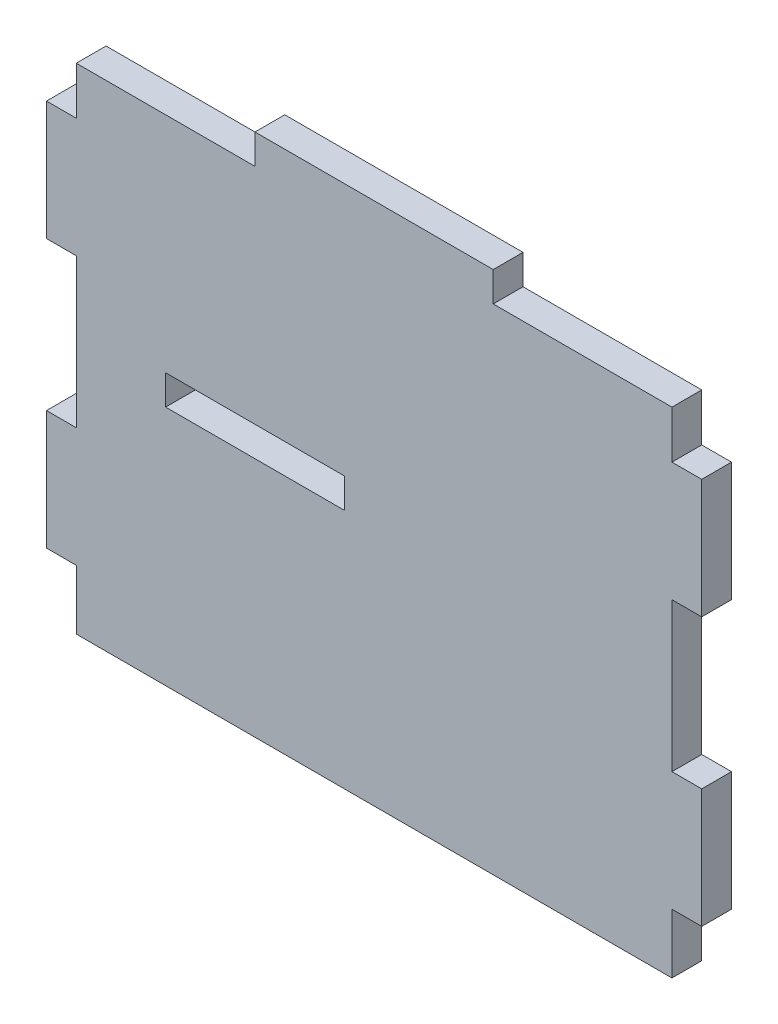
ISO-10303-21;
HEADER;
FILE_DESCRIPTION(('STEP AP214'),'2;1');
FILE_NAME('part.step','',(''),(''),'','','');
FILE_SCHEMA(('AUTOMOTIVE_DESIGN { 1 0 10303 214 1 1 1 1 }'));
ENDSEC;
DATA;
#1=APPLICATION_CONTEXT('core data for automotive mechanical design processes');
#2=APPLICATION_PROTOCOL_DEFINITION('international standard','automotive_design',2000,#1);
#3=PRODUCT_CONTEXT('',#1,'mechanical');
#4=PRODUCT('Part','Part','',(#3));
#5=PRODUCT_RELATED_PRODUCT_CATEGORY('part','',(#4));
#6=PRODUCT_DEFINITION_FORMATION('','',#4);
#7=PRODUCT_DEFINITION_CONTEXT('part definition',#1,'design');
#8=PRODUCT_DEFINITION('design','',#6,#7);
#9=PRODUCT_DEFINITION_SHAPE('','',#8);
#10=(LENGTH_UNIT() NAMED_UNIT(*) SI_UNIT(.MILLI.,.METRE.));
#11=(NAMED_UNIT(*) PLANE_ANGLE_UNIT() SI_UNIT($,.RADIAN.));
#12=(NAMED_UNIT(*) SI_UNIT($,.STERADIAN.) SOLID_ANGLE_UNIT());
#13=UNCERTAINTY_MEASURE_WITH_UNIT(LENGTH_MEASURE(1.E-05),#10,'distance_accuracy_value','');
#14=(GEOMETRIC_REPRESENTATION_CONTEXT(3) GLOBAL_UNCERTAINTY_ASSIGNED_CONTEXT((#13)) GLOBAL_UNIT_ASSIGNED_CONTEXT((#10,
#11,#12)) REPRESENTATION_CONTEXT('',''));
#15=CARTESIAN_POINT('',(0.,0.,0.));
#16=DIRECTION('',(0.,0.,1.));
#17=DIRECTION('',(1.,0.,0.));
#18=AXIS2_PLACEMENT_3D('',#15,#16,#17);
#19=CARTESIAN_POINT('',(0.,0.,5.));
#20=DIRECTION('',(0.,0.,1.));
#21=DIRECTION('',(1.,0.,0.));
#22=AXIS2_PLACEMENT_3D('',#19,#20,#21);
#23=PLANE('',#22);
#24=DIRECTION('',(0.,-1.,0.));
#25=VECTOR('',#24,1.);
#26=CARTESIAN_POINT('',(0.,0.,5.));
#27=LINE('',#26,#25);
#28=CARTESIAN_POINT('',(0.,10.,5.));
#29=VERTEX_POINT('',#28);
#30=CARTESIAN_POINT('',(0.,0.,5.));
#31=VERTEX_POINT('',#30);
#32=EDGE_CURVE('E275',#29,#31,#27,.T.);
#33=ORIENTED_EDGE('',*,*,#32,.T.);
#34=DIRECTION('',(1.,0.,0.));
#35=VECTOR('',#34,1.);
#36=CARTESIAN_POINT('',(0.,0.,5.));
#37=LINE('',#36,#35);
#38=CARTESIAN_POINT('',(100.,0.,5.));
#39=VERTEX_POINT('',#38);
#40=EDGE_CURVE('E279',#31,#39,#37,.T.);
#41=ORIENTED_EDGE('',*,*,#40,.T.);
#42=DIRECTION('',(0.,1.,0.));
#43=VECTOR('',#42,1.);
#44=CARTESIAN_POINT('',(100.,0.,5.));
#45=LINE('',#44,#43);
#46=CARTESIAN_POINT('',(100.,10.,5.));
#47=VERTEX_POINT('',#46);
#48=EDGE_CURVE('E283',#39,#47,#45,.T.);
#49=ORIENTED_EDGE('',*,*,#48,.T.);
#50=DIRECTION('',(1.,0.,0.));
#51=VECTOR('',#50,1.);
#52=CARTESIAN_POINT('',(100.,10.,5.));
#53=LINE('',#52,#51);
#54=CARTESIAN_POINT('',(105.,10.,5.));
#55=VERTEX_POINT('',#54);
#56=EDGE_CURVE('E286',#47,#55,#53,.T.);
#57=ORIENTED_EDGE('',*,*,#56,.T.);
#58=DIRECTION('',(0.,1.,0.));
#59=VECTOR('',#58,1.);
#60=CARTESIAN_POINT('',(105.,30.,5.));
#61=LINE('',#60,#59);
#62=CARTESIAN_POINT('',(105.,30.,5.));
#63=VERTEX_POINT('',#62);
#64=EDGE_CURVE('E289',#55,#63,#61,.T.);
#65=ORIENTED_EDGE('',*,*,#64,.T.);
#66=DIRECTION('',(-1.,0.,0.));
#67=VECTOR('',#66,1.);
#68=CARTESIAN_POINT('',(100.,30.,5.));
#69=LINE('',#68,#67);
#70=CARTESIAN_POINT('',(100.,30.,5.));
#71=VERTEX_POINT('',#70);
#72=EDGE_CURVE('E292',#63,#71,#69,.T.);
#73=ORIENTED_EDGE('',*,*,#72,.T.);
#74=DIRECTION('',(0.,1.,0.));
#75=VECTOR('',#74,1.);
#76=CARTESIAN_POINT('',(100.,30.,5.));
#77=LINE('',#76,#75);
#78=CARTESIAN_POINT('',(100.,55.,5.));
#79=VERTEX_POINT('',#78);
#80=EDGE_CURVE('E295',#71,#79,#77,.T.);
#81=ORIENTED_EDGE('',*,*,#80,.T.);
#82=DIRECTION('',(1.,0.,0.));
#83=VECTOR('',#82,1.);
#84=CARTESIAN_POINT('',(100.,55.,5.));
#85=LINE('',#84,#83);
#86=CARTESIAN_POINT('',(105.,55.,5.));
#87=VERTEX_POINT('',#86);
#88=EDGE_CURVE('E298',#79,#87,#85,.T.);
#89=ORIENTED_EDGE('',*,*,#88,.T.);
#90=DIRECTION('',(0.,1.,0.));
#91=VECTOR('',#90,1.);
#92=CARTESIAN_POINT('',(105.,75.,5.));
#93=LINE('',#92,#91);
#94=CARTESIAN_POINT('',(105.,75.,5.));
#95=VERTEX_POINT('',#94);
#96=EDGE_CURVE('E301',#87,#95,#93,.T.);
#97=ORIENTED_EDGE('',*,*,#96,.T.);
#98=DIRECTION('',(-1.,0.,0.));
#99=VECTOR('',#98,1.);
#100=CARTESIAN_POINT('',(100.,75.,5.));
#101=LINE('',#100,#99);
#102=CARTESIAN_POINT('',(100.,75.,5.));
#103=VERTEX_POINT('',#102);
#104=EDGE_CURVE('E304',#95,#103,#101,.T.);
#105=ORIENTED_EDGE('',*,*,#104,.T.);
#106=DIRECTION('',(0.,1.,0.));
#107=VECTOR('',#106,1.);
#108=CARTESIAN_POINT('',(100.,75.,5.));
#109=LINE('',#108,#107);
#110=CARTESIAN_POINT('',(100.,83.,5.));
#111=VERTEX_POINT('',#110);
#112=EDGE_CURVE('E307',#103,#111,#109,.T.);
#113=ORIENTED_EDGE('',*,*,#112,.T.);
#114=DIRECTION('',(-1.,0.,0.));
#115=VECTOR('',#114,1.);
#116=CARTESIAN_POINT('',(70.,83.,5.));
#117=LINE('',#116,#115);
#118=CARTESIAN_POINT('',(70.,83.,5.));
#119=VERTEX_POINT('',#118);
#120=EDGE_CURVE('E310',#111,#119,#117,.T.);
#121=ORIENTED_EDGE('',*,*,#120,.T.);
#122=DIRECTION('',(0.,1.,0.));
#123=VECTOR('',#122,1.);
#124=CARTESIAN_POINT('',(70.,83.,5.));
#125=LINE('',#124,#123);
#126=CARTESIAN_POINT('',(70.,88.,5.));
#127=VERTEX_POINT('',#126);
#128=EDGE_CURVE('E313',#119,#127,#125,.T.);
#129=ORIENTED_EDGE('',*,*,#128,.T.);
#130=DIRECTION('',(-1.,0.,0.));
#131=VECTOR('',#130,1.);
#132=CARTESIAN_POINT('',(30.,88.,5.));
#133=LINE('',#132,#131);
#134=CARTESIAN_POINT('',(30.,88.,5.));
#135=VERTEX_POINT('',#134);
#136=EDGE_CURVE('E316',#127,#135,#133,.T.);
#137=ORIENTED_EDGE('',*,*,#136,.T.);
#138=DIRECTION('',(0.,-1.,0.));
#139=VECTOR('',#138,1.);
#140=CARTESIAN_POINT('',(30.,83.,5.));
#141=LINE('',#140,#139);
#142=CARTESIAN_POINT('',(30.,83.,5.));
#143=VERTEX_POINT('',#142);
#144=EDGE_CURVE('E319',#135,#143,#141,.T.);
#145=ORIENTED_EDGE('',*,*,#144,.T.);
#146=DIRECTION('',(-1.,0.,0.));
#147=VECTOR('',#146,1.);
#148=CARTESIAN_POINT('',(0.,83.,5.));
#149=LINE('',#148,#147);
#150=CARTESIAN_POINT('',(0.,83.,5.));
#151=VERTEX_POINT('',#150);
#152=EDGE_CURVE('E322',#143,#151,#149,.T.);
#153=ORIENTED_EDGE('',*,*,#152,.T.);
#154=DIRECTION('',(0.,-1.,0.));
#155=VECTOR('',#154,1.);
#156=CARTESIAN_POINT('',(0.,75.,5.));
#157=LINE('',#156,#155);
#158=CARTESIAN_POINT('',(0.,75.,5.));
#159=VERTEX_POINT('',#158);
#160=EDGE_CURVE('E325',#151,#159,#157,.T.);
#161=ORIENTED_EDGE('',*,*,#160,.T.);
#162=DIRECTION('',(-1.,0.,0.));
#163=VECTOR('',#162,1.);
#164=CARTESIAN_POINT('',(0.,75.,5.));
#165=LINE('',#164,#163);
#166=CARTESIAN_POINT('',(-5.,75.,5.));
#167=VERTEX_POINT('',#166);
#168=EDGE_CURVE('E328',#159,#167,#165,.T.);
#169=ORIENTED_EDGE('',*,*,#168,.T.);
#170=DIRECTION('',(0.,-1.,0.));
#171=VECTOR('',#170,1.);
#172=CARTESIAN_POINT('',(-5.,75.,5.));
#173=LINE('',#172,#171);
#174=CARTESIAN_POINT('',(-5.,55.,5.));
#175=VERTEX_POINT('',#174);
#176=EDGE_CURVE('E331',#167,#175,#173,.T.);
#177=ORIENTED_EDGE('',*,*,#176,.T.);
#178=DIRECTION('',(1.,0.,0.));
#179=VECTOR('',#178,1.);
#180=CARTESIAN_POINT('',(0.,55.,5.));
#181=LINE('',#180,#179);
#182=CARTESIAN_POINT('',(0.,55.,5.));
#183=VERTEX_POINT('',#182);
#184=EDGE_CURVE('E334',#175,#183,#181,.T.);
#185=ORIENTED_EDGE('',*,*,#184,.T.);
#186=DIRECTION('',(0.,-1.,0.));
#187=VECTOR('',#186,1.);
#188=CARTESIAN_POINT('',(0.,30.,5.));
#189=LINE('',#188,#187);
#190=CARTESIAN_POINT('',(0.,30.,5.));
#191=VERTEX_POINT('',#190);
#192=EDGE_CURVE('E337',#183,#191,#189,.T.);
#193=ORIENTED_EDGE('',*,*,#192,.T.);
#194=DIRECTION('',(-1.,0.,0.));
#195=VECTOR('',#194,1.);
#196=CARTESIAN_POINT('',(0.,30.,5.));
#197=LINE('',#196,#195);
#198=CARTESIAN_POINT('',(-5.,30.,5.));
#199=VERTEX_POINT('',#198);
#200=EDGE_CURVE('E340',#191,#199,#197,.T.);
#201=ORIENTED_EDGE('',*,*,#200,.T.);
#202=DIRECTION('',(0.,-1.,0.));
#203=VECTOR('',#202,1.);
#204=CARTESIAN_POINT('',(-5.,10.,5.));
#205=LINE('',#204,#203);
#206=CARTESIAN_POINT('',(-5.,10.,5.));
#207=VERTEX_POINT('',#206);
#208=EDGE_CURVE('E343',#199,#207,#205,.T.);
#209=ORIENTED_EDGE('',*,*,#208,.T.);
#210=DIRECTION('',(1.,0.,0.));
#211=VECTOR('',#210,1.);
#212=CARTESIAN_POINT('',(0.,10.,5.));
#213=LINE('',#212,#211);
#214=EDGE_CURVE('E346',#207,#29,#213,.T.);
#215=ORIENTED_EDGE('',*,*,#214,.T.);
#216=EDGE_LOOP('',(#33,#41,#49,#57,#65,#73,#81,#89,#97,#105,#113,#121,#129,#137,#145,#153,#161,
#169,#177,#185,#193,#201,#209,#215));
#217=FACE_BOUND('',#216,.T.);
#218=DIRECTION('',(1.,0.,0.));
#219=VECTOR('',#218,1.);
#220=CARTESIAN_POINT('',(15.,40.5,5.));
#221=LINE('',#220,#219);
#222=CARTESIAN_POINT('',(15.,40.5,5.));
#223=VERTEX_POINT('',#222);
#224=CARTESIAN_POINT('',(45.,40.5,5.));
#225=VERTEX_POINT('',#224);
#226=EDGE_CURVE('E236',#223,#225,#221,.T.);
#227=ORIENTED_EDGE('',*,*,#226,.F.);
#228=DIRECTION('',(0.,-1.,0.));
#229=VECTOR('',#228,1.);
#230=CARTESIAN_POINT('',(15.,45.5,5.));
#231=LINE('',#230,#229);
#232=CARTESIAN_POINT('',(15.,45.5,5.));
#233=VERTEX_POINT('',#232);
#234=EDGE_CURVE('E227',#233,#223,#231,.T.);
#235=ORIENTED_EDGE('',*,*,#234,.F.);
#236=DIRECTION('',(-1.,0.,0.));
#237=VECTOR('',#236,1.);
#238=CARTESIAN_POINT('',(15.,45.5,5.));
#239=LINE('',#238,#237);
#240=CARTESIAN_POINT('',(45.,45.5,5.));
#241=VERTEX_POINT('',#240);
#242=EDGE_CURVE('E253',#241,#233,#239,.T.);
#243=ORIENTED_EDGE('',*,*,#242,.F.);
#244=DIRECTION('',(0.,1.,0.));
#245=VECTOR('',#244,1.);
#246=CARTESIAN_POINT('',(45.,45.5,5.));
#247=LINE('',#246,#245);
#248=EDGE_CURVE('E249',#225,#241,#247,.T.);
#249=ORIENTED_EDGE('',*,*,#248,.F.);
#250=EDGE_LOOP('',(#227,#235,#243,#249));
#251=FACE_BOUND('',#250,.T.);
#252=ADVANCED_FACE('F41',(#217,#251),#23,.T.);
#253=CARTESIAN_POINT('',(0.,0.,0.));
#254=DIRECTION('',(0.,0.,1.));
#255=DIRECTION('',(1.,0.,0.));
#256=AXIS2_PLACEMENT_3D('',#253,#254,#255);
#257=PLANE('',#256);
#258=DIRECTION('',(0.,-1.,0.));
#259=VECTOR('',#258,1.);
#260=CARTESIAN_POINT('',(0.,0.,0.));
#261=LINE('',#260,#259);
#262=CARTESIAN_POINT('',(0.,10.,0.));
#263=VERTEX_POINT('',#262);
#264=CARTESIAN_POINT('',(0.,0.,0.));
#265=VERTEX_POINT('',#264);
#266=EDGE_CURVE('E245',#263,#265,#261,.T.);
#267=ORIENTED_EDGE('',*,*,#266,.F.);
#268=DIRECTION('',(1.,0.,0.));
#269=VECTOR('',#268,1.);
#270=CARTESIAN_POINT('',(0.,10.,0.));
#271=LINE('',#270,#269);
#272=CARTESIAN_POINT('',(-5.,10.,0.));
#273=VERTEX_POINT('',#272);
#274=EDGE_CURVE('E280',#273,#263,#271,.T.);
#275=ORIENTED_EDGE('',*,*,#274,.F.);
#276=DIRECTION('',(0.,-1.,0.));
#277=VECTOR('',#276,1.);
#278=CARTESIAN_POINT('',(-5.,10.,0.));
#279=LINE('',#278,#277);
#280=CARTESIAN_POINT('',(-5.,30.,0.));
#281=VERTEX_POINT('',#280);
#282=EDGE_CURVE('E416',#281,#273,#279,.T.);
#283=ORIENTED_EDGE('',*,*,#282,.F.);
#284=DIRECTION('',(-1.,0.,0.));
#285=VECTOR('',#284,1.);
#286=CARTESIAN_POINT('',(0.,30.,0.));
#287=LINE('',#286,#285);
#288=CARTESIAN_POINT('',(0.,30.,0.));
#289=VERTEX_POINT('',#288);
#290=EDGE_CURVE('E413',#289,#281,#287,.T.);
#291=ORIENTED_EDGE('',*,*,#290,.F.);
#292=DIRECTION('',(0.,-1.,0.));
#293=VECTOR('',#292,1.);
#294=CARTESIAN_POINT('',(0.,30.,0.));
#295=LINE('',#294,#293);
#296=CARTESIAN_POINT('',(0.,55.,0.));
#297=VERTEX_POINT('',#296);
#298=EDGE_CURVE('E410',#297,#289,#295,.T.);
#299=ORIENTED_EDGE('',*,*,#298,.F.);
#300=DIRECTION('',(1.,0.,0.));
#301=VECTOR('',#300,1.);
#302=CARTESIAN_POINT('',(0.,55.,0.));
#303=LINE('',#302,#301);
#304=CARTESIAN_POINT('',(-5.,55.,0.));
#305=VERTEX_POINT('',#304);
#306=EDGE_CURVE('E407',#305,#297,#303,.T.);
#307=ORIENTED_EDGE('',*,*,#306,.F.);
#308=DIRECTION('',(0.,-1.,0.));
#309=VECTOR('',#308,1.);
#310=CARTESIAN_POINT('',(-5.,75.,0.));
#311=LINE('',#310,#309);
#312=CARTESIAN_POINT('',(-5.,75.,0.));
#313=VERTEX_POINT('',#312);
#314=EDGE_CURVE('E404',#313,#305,#311,.T.);
#315=ORIENTED_EDGE('',*,*,#314,.F.);
#316=DIRECTION('',(-1.,0.,0.));
#317=VECTOR('',#316,1.);
#318=CARTESIAN_POINT('',(0.,75.,0.));
#319=LINE('',#318,#317);
#320=CARTESIAN_POINT('',(0.,75.,0.));
#321=VERTEX_POINT('',#320);
#322=EDGE_CURVE('E401',#321,#313,#319,.T.);
#323=ORIENTED_EDGE('',*,*,#322,.F.);
#324=DIRECTION('',(0.,-1.,0.));
#325=VECTOR('',#324,1.);
#326=CARTESIAN_POINT('',(0.,75.,0.));
#327=LINE('',#326,#325);
#328=CARTESIAN_POINT('',(0.,83.,0.));
#329=VERTEX_POINT('',#328);
#330=EDGE_CURVE('E398',#329,#321,#327,.T.);
#331=ORIENTED_EDGE('',*,*,#330,.F.);
#332=DIRECTION('',(-1.,0.,0.));
#333=VECTOR('',#332,1.);
#334=CARTESIAN_POINT('',(0.,83.,0.));
#335=LINE('',#334,#333);
#336=CARTESIAN_POINT('',(30.,83.,0.));
#337=VERTEX_POINT('',#336);
#338=EDGE_CURVE('E395',#337,#329,#335,.T.);
#339=ORIENTED_EDGE('',*,*,#338,.F.);
#340=DIRECTION('',(0.,-1.,0.));
#341=VECTOR('',#340,1.);
#342=CARTESIAN_POINT('',(30.,83.,0.));
#343=LINE('',#342,#341);
#344=CARTESIAN_POINT('',(30.,88.,0.));
#345=VERTEX_POINT('',#344);
#346=EDGE_CURVE('E392',#345,#337,#343,.T.);
#347=ORIENTED_EDGE('',*,*,#346,.F.);
#348=DIRECTION('',(-1.,0.,0.));
#349=VECTOR('',#348,1.);
#350=CARTESIAN_POINT('',(30.,88.,0.));
#351=LINE('',#350,#349);
#352=CARTESIAN_POINT('',(70.,88.,0.));
#353=VERTEX_POINT('',#352);
#354=EDGE_CURVE('E389',#353,#345,#351,.T.);
#355=ORIENTED_EDGE('',*,*,#354,.F.);
#356=DIRECTION('',(0.,1.,0.));
#357=VECTOR('',#356,1.);
#358=CARTESIAN_POINT('',(70.,83.,0.));
#359=LINE('',#358,#357);
#360=CARTESIAN_POINT('',(70.,83.,0.));
#361=VERTEX_POINT('',#360);
#362=EDGE_CURVE('E386',#361,#353,#359,.T.);
#363=ORIENTED_EDGE('',*,*,#362,.F.);
#364=DIRECTION('',(-1.,0.,0.));
#365=VECTOR('',#364,1.);
#366=CARTESIAN_POINT('',(70.,83.,0.));
#367=LINE('',#366,#365);
#368=CARTESIAN_POINT('',(100.,83.,0.));
#369=VERTEX_POINT('',#368);
#370=EDGE_CURVE('E383',#369,#361,#367,.T.);
#371=ORIENTED_EDGE('',*,*,#370,.F.);
#372=DIRECTION('',(0.,1.,0.));
#373=VECTOR('',#372,1.);
#374=CARTESIAN_POINT('',(100.,75.,0.));
#375=LINE('',#374,#373);
#376=CARTESIAN_POINT('',(100.,75.,0.));
#377=VERTEX_POINT('',#376);
#378=EDGE_CURVE('E380',#377,#369,#375,.T.);
#379=ORIENTED_EDGE('',*,*,#378,.F.);
#380=DIRECTION('',(-1.,0.,0.));
#381=VECTOR('',#380,1.);
#382=CARTESIAN_POINT('',(100.,75.,0.));
#383=LINE('',#382,#381);
#384=CARTESIAN_POINT('',(105.,75.,0.));
#385=VERTEX_POINT('',#384);
#386=EDGE_CURVE('E377',#385,#377,#383,.T.);
#387=ORIENTED_EDGE('',*,*,#386,.F.);
#388=DIRECTION('',(0.,1.,0.));
#389=VECTOR('',#388,1.);
#390=CARTESIAN_POINT('',(105.,75.,0.));
#391=LINE('',#390,#389);
#392=CARTESIAN_POINT('',(105.,55.,0.));
#393=VERTEX_POINT('',#392);
#394=EDGE_CURVE('E374',#393,#385,#391,.T.);
#395=ORIENTED_EDGE('',*,*,#394,.F.);
#396=DIRECTION('',(1.,0.,0.));
#397=VECTOR('',#396,1.);
#398=CARTESIAN_POINT('',(100.,55.,0.));
#399=LINE('',#398,#397);
#400=CARTESIAN_POINT('',(100.,55.,0.));
#401=VERTEX_POINT('',#400);
#402=EDGE_CURVE('E371',#401,#393,#399,.T.);
#403=ORIENTED_EDGE('',*,*,#402,.F.);
#404=DIRECTION('',(0.,1.,0.));
#405=VECTOR('',#404,1.);
#406=CARTESIAN_POINT('',(100.,30.,0.));
#407=LINE('',#406,#405);
#408=CARTESIAN_POINT('',(100.,30.,0.));
#409=VERTEX_POINT('',#408);
#410=EDGE_CURVE('E368',#409,#401,#407,.T.);
#411=ORIENTED_EDGE('',*,*,#410,.F.);
#412=DIRECTION('',(-1.,0.,0.));
#413=VECTOR('',#412,1.);
#414=CARTESIAN_POINT('',(100.,30.,0.));
#415=LINE('',#414,#413);
#416=CARTESIAN_POINT('',(105.,30.,0.));
#417=VERTEX_POINT('',#416);
#418=EDGE_CURVE('E365',#417,#409,#415,.T.);
#419=ORIENTED_EDGE('',*,*,#418,.F.);
#420=DIRECTION('',(0.,1.,0.));
#421=VECTOR('',#420,1.);
#422=CARTESIAN_POINT('',(105.,30.,0.));
#423=LINE('',#422,#421);
#424=CARTESIAN_POINT('',(105.,10.,0.));
#425=VERTEX_POINT('',#424);
#426=EDGE_CURVE('E362',#425,#417,#423,.T.);
#427=ORIENTED_EDGE('',*,*,#426,.F.);
#428=DIRECTION('',(1.,0.,0.));
#429=VECTOR('',#428,1.);
#430=CARTESIAN_POINT('',(100.,10.,0.));
#431=LINE('',#430,#429);
#432=CARTESIAN_POINT('',(100.,10.,0.));
#433=VERTEX_POINT('',#432);
#434=EDGE_CURVE('E359',#433,#425,#431,.T.);
#435=ORIENTED_EDGE('',*,*,#434,.F.);
#436=DIRECTION('',(0.,1.,0.));
#437=VECTOR('',#436,1.);
#438=CARTESIAN_POINT('',(100.,0.,0.));
#439=LINE('',#438,#437);
#440=CARTESIAN_POINT('',(100.,0.,0.));
#441=VERTEX_POINT('',#440);
#442=EDGE_CURVE('E356',#441,#433,#439,.T.);
#443=ORIENTED_EDGE('',*,*,#442,.F.);
#444=DIRECTION('',(1.,0.,0.));
#445=VECTOR('',#444,1.);
#446=CARTESIAN_POINT('',(0.,0.,0.));
#447=LINE('',#446,#445);
#448=EDGE_CURVE('E353',#265,#441,#447,.T.);
#449=ORIENTED_EDGE('',*,*,#448,.F.);
#450=EDGE_LOOP('',(#267,#275,#283,#291,#299,#307,#315,#323,#331,#339,#347,#355,#363,#371,#379,
#387,#395,#403,#411,#419,#427,#435,#443,#449));
#451=FACE_BOUND('',#450,.T.);
#452=DIRECTION('',(0.,-1.,0.));
#453=VECTOR('',#452,1.);
#454=CARTESIAN_POINT('',(15.,45.5,0.));
#455=LINE('',#454,#453);
#456=CARTESIAN_POINT('',(15.,45.5,0.));
#457=VERTEX_POINT('',#456);
#458=CARTESIAN_POINT('',(15.,40.5,0.));
#459=VERTEX_POINT('',#458);
#460=EDGE_CURVE('E65',#457,#459,#455,.T.);
#461=ORIENTED_EDGE('',*,*,#460,.T.);
#462=DIRECTION('',(1.,0.,0.));
#463=VECTOR('',#462,1.);
#464=CARTESIAN_POINT('',(15.,40.5,0.));
#465=LINE('',#464,#463);
#466=CARTESIAN_POINT('',(45.,40.5,0.));
#467=VERTEX_POINT('',#466);
#468=EDGE_CURVE('E243',#459,#467,#465,.T.);
#469=ORIENTED_EDGE('',*,*,#468,.T.);
#470=DIRECTION('',(0.,1.,0.));
#471=VECTOR('',#470,1.);
#472=CARTESIAN_POINT('',(45.,45.5,0.));
#473=LINE('',#472,#471);
#474=CARTESIAN_POINT('',(45.,45.5,0.));
#475=VERTEX_POINT('',#474);
#476=EDGE_CURVE('E262',#467,#475,#473,.T.);
#477=ORIENTED_EDGE('',*,*,#476,.T.);
#478=DIRECTION('',(-1.,0.,0.));
#479=VECTOR('',#478,1.);
#480=CARTESIAN_POINT('',(15.,45.5,0.));
#481=LINE('',#480,#479);
#482=EDGE_CURVE('E237',#475,#457,#481,.T.);
#483=ORIENTED_EDGE('',*,*,#482,.T.);
#484=EDGE_LOOP('',(#461,#469,#477,#483));
#485=FACE_BOUND('',#484,.T.);
#486=ADVANCED_FACE('F519',(#451,#485),#257,.F.);
#487=CARTESIAN_POINT('',(0.,0.,5.));
#488=DIRECTION('',(1.,0.,0.));
#489=DIRECTION('',(0.,0.,-1.));
#490=AXIS2_PLACEMENT_3D('',#487,#488,#489);
#491=PLANE('',#490);
#492=ORIENTED_EDGE('',*,*,#266,.T.);
#493=DIRECTION('',(0.,0.,-1.));
#494=VECTOR('',#493,1.);
#495=CARTESIAN_POINT('',(0.,0.,5.));
#496=LINE('',#495,#494);
#497=EDGE_CURVE('E11',#31,#265,#496,.T.);
#498=ORIENTED_EDGE('',*,*,#497,.F.);
#499=ORIENTED_EDGE('',*,*,#32,.F.);
#500=DIRECTION('',(0.,0.,-1.));
#501=VECTOR('',#500,1.);
#502=CARTESIAN_POINT('',(0.,10.,5.));
#503=LINE('',#502,#501);
#504=EDGE_CURVE('E349',#29,#263,#503,.T.);
#505=ORIENTED_EDGE('',*,*,#504,.T.);
#506=EDGE_LOOP('',(#492,#498,#499,#505));
#507=FACE_BOUND('',#506,.T.);
#508=ADVANCED_FACE('F43',(#507),#491,.F.);
#509=CARTESIAN_POINT('',(0.,0.,5.));
#510=DIRECTION('',(0.,1.,0.));
#511=DIRECTION('',(0.,0.,1.));
#512=AXIS2_PLACEMENT_3D('',#509,#510,#511);
#513=PLANE('',#512);
#514=ORIENTED_EDGE('',*,*,#448,.T.);
#515=DIRECTION('',(0.,0.,-1.));
#516=VECTOR('',#515,1.);
#517=CARTESIAN_POINT('',(100.,0.,5.));
#518=LINE('',#517,#516);
#519=EDGE_CURVE('E50',#39,#441,#518,.T.);
#520=ORIENTED_EDGE('',*,*,#519,.F.);
#521=ORIENTED_EDGE('',*,*,#40,.F.);
#522=ORIENTED_EDGE('',*,*,#497,.T.);
#523=EDGE_LOOP('',(#514,#520,#521,#522));
#524=FACE_BOUND('',#523,.T.);
#525=ADVANCED_FACE('F536',(#524),#513,.F.);
#526=CARTESIAN_POINT('',(100.,0.,5.));
#527=DIRECTION('',(-1.,0.,0.));
#528=DIRECTION('',(0.,0.,1.));
#529=AXIS2_PLACEMENT_3D('',#526,#527,#528);
#530=PLANE('',#529);
#531=ORIENTED_EDGE('',*,*,#442,.T.);
#532=DIRECTION('',(0.,0.,-1.));
#533=VECTOR('',#532,1.);
#534=CARTESIAN_POINT('',(100.,10.,5.));
#535=LINE('',#534,#533);
#536=EDGE_CURVE('E504',#47,#433,#535,.T.);
#537=ORIENTED_EDGE('',*,*,#536,.F.);
#538=ORIENTED_EDGE('',*,*,#48,.F.);
#539=ORIENTED_EDGE('',*,*,#519,.T.);
#540=EDGE_LOOP('',(#531,#537,#538,#539));
#541=FACE_BOUND('',#540,.T.);
#542=ADVANCED_FACE('F513',(#541),#530,.F.);
#543=CARTESIAN_POINT('',(100.,10.,5.));
#544=DIRECTION('',(0.,1.,0.));
#545=DIRECTION('',(0.,0.,1.));
#546=AXIS2_PLACEMENT_3D('',#543,#544,#545);
#547=PLANE('',#546);
#548=ORIENTED_EDGE('',*,*,#434,.T.);
#549=DIRECTION('',(0.,0.,-1.));
#550=VECTOR('',#549,1.);
#551=CARTESIAN_POINT('',(105.,10.,5.));
#552=LINE('',#551,#550);
#553=EDGE_CURVE('E500',#55,#425,#552,.T.);
#554=ORIENTED_EDGE('',*,*,#553,.F.);
#555=ORIENTED_EDGE('',*,*,#56,.F.);
#556=ORIENTED_EDGE('',*,*,#536,.T.);
#557=EDGE_LOOP('',(#548,#554,#555,#556));
#558=FACE_BOUND('',#557,.T.);
#559=ADVANCED_FACE('F525',(#558),#547,.F.);
#560=CARTESIAN_POINT('',(105.,30.,5.));
#561=DIRECTION('',(-1.,0.,0.));
#562=DIRECTION('',(0.,0.,1.));
#563=AXIS2_PLACEMENT_3D('',#560,#561,#562);
#564=PLANE('',#563);
#565=ORIENTED_EDGE('',*,*,#426,.T.);
#566=DIRECTION('',(0.,0.,-1.));
#567=VECTOR('',#566,1.);
#568=CARTESIAN_POINT('',(105.,30.,5.));
#569=LINE('',#568,#567);
#570=EDGE_CURVE('E496',#63,#417,#569,.T.);
#571=ORIENTED_EDGE('',*,*,#570,.F.);
#572=ORIENTED_EDGE('',*,*,#64,.F.);
#573=ORIENTED_EDGE('',*,*,#553,.T.);
#574=EDGE_LOOP('',(#565,#571,#572,#573));
#575=FACE_BOUND('',#574,.T.);
#576=ADVANCED_FACE('F529',(#575),#564,.F.);
#577=CARTESIAN_POINT('',(100.,30.,5.));
#578=DIRECTION('',(0.,-1.,0.));
#579=DIRECTION('',(0.,0.,-1.));
#580=AXIS2_PLACEMENT_3D('',#577,#578,#579);
#581=PLANE('',#580);
#582=ORIENTED_EDGE('',*,*,#418,.T.);
#583=DIRECTION('',(0.,0.,-1.));
#584=VECTOR('',#583,1.);
#585=CARTESIAN_POINT('',(100.,30.,5.));
#586=LINE('',#585,#584);
#587=EDGE_CURVE('E492',#71,#409,#586,.T.);
#588=ORIENTED_EDGE('',*,*,#587,.F.);
#589=ORIENTED_EDGE('',*,*,#72,.F.);
#590=ORIENTED_EDGE('',*,*,#570,.T.);
#591=EDGE_LOOP('',(#582,#588,#589,#590));
#592=FACE_BOUND('',#591,.T.);
#593=ADVANCED_FACE('F629',(#592),#581,.F.);
#594=CARTESIAN_POINT('',(100.,30.,5.));
#595=DIRECTION('',(-1.,0.,0.));
#596=DIRECTION('',(0.,0.,1.));
#597=AXIS2_PLACEMENT_3D('',#594,#595,#596);
#598=PLANE('',#597);
#599=ORIENTED_EDGE('',*,*,#410,.T.);
#600=DIRECTION('',(0.,0.,-1.));
#601=VECTOR('',#600,1.);
#602=CARTESIAN_POINT('',(100.,55.,5.));
#603=LINE('',#602,#601);
#604=EDGE_CURVE('E488',#79,#401,#603,.T.);
#605=ORIENTED_EDGE('',*,*,#604,.F.);
#606=ORIENTED_EDGE('',*,*,#80,.F.);
#607=ORIENTED_EDGE('',*,*,#587,.T.);
#608=EDGE_LOOP('',(#599,#605,#606,#607));
#609=FACE_BOUND('',#608,.T.);
#610=ADVANCED_FACE('F627',(#609),#598,.F.);
#611=CARTESIAN_POINT('',(100.,55.,5.));
#612=DIRECTION('',(0.,1.,0.));
#613=DIRECTION('',(0.,0.,1.));
#614=AXIS2_PLACEMENT_3D('',#611,#612,#613);
#615=PLANE('',#614);
#616=ORIENTED_EDGE('',*,*,#402,.T.);
#617=DIRECTION('',(0.,0.,-1.));
#618=VECTOR('',#617,1.);
#619=CARTESIAN_POINT('',(105.,55.,5.));
#620=LINE('',#619,#618);
#621=EDGE_CURVE('E484',#87,#393,#620,.T.);
#622=ORIENTED_EDGE('',*,*,#621,.F.);
#623=ORIENTED_EDGE('',*,*,#88,.F.);
#624=ORIENTED_EDGE('',*,*,#604,.T.);
#625=EDGE_LOOP('',(#616,#622,#623,#624));
#626=FACE_BOUND('',#625,.T.);
#627=ADVANCED_FACE('F623',(#626),#615,.F.);
#628=CARTESIAN_POINT('',(105.,75.,5.));
#629=DIRECTION('',(-1.,0.,0.));
#630=DIRECTION('',(0.,0.,1.));
#631=AXIS2_PLACEMENT_3D('',#628,#629,#630);
#632=PLANE('',#631);
#633=ORIENTED_EDGE('',*,*,#394,.T.);
#634=DIRECTION('',(0.,0.,-1.));
#635=VECTOR('',#634,1.);
#636=CARTESIAN_POINT('',(105.,75.,5.));
#637=LINE('',#636,#635);
#638=EDGE_CURVE('E480',#95,#385,#637,.T.);
#639=ORIENTED_EDGE('',*,*,#638,.F.);
#640=ORIENTED_EDGE('',*,*,#96,.F.);
#641=ORIENTED_EDGE('',*,*,#621,.T.);
#642=EDGE_LOOP('',(#633,#639,#640,#641));
#643=FACE_BOUND('',#642,.T.);
#644=ADVANCED_FACE('F618',(#643),#632,.F.);
#645=CARTESIAN_POINT('',(100.,75.,5.));
#646=DIRECTION('',(0.,-1.,0.));
#647=DIRECTION('',(0.,0.,-1.));
#648=AXIS2_PLACEMENT_3D('',#645,#646,#647);
#649=PLANE('',#648);
#650=ORIENTED_EDGE('',*,*,#386,.T.);
#651=DIRECTION('',(0.,0.,-1.));
#652=VECTOR('',#651,1.);
#653=CARTESIAN_POINT('',(100.,75.,5.));
#654=LINE('',#653,#652);
#655=EDGE_CURVE('E476',#103,#377,#654,.T.);
#656=ORIENTED_EDGE('',*,*,#655,.F.);
#657=ORIENTED_EDGE('',*,*,#104,.F.);
#658=ORIENTED_EDGE('',*,*,#638,.T.);
#659=EDGE_LOOP('',(#650,#656,#657,#658));
#660=FACE_BOUND('',#659,.T.);
#661=ADVANCED_FACE('F612',(#660),#649,.F.);
#662=CARTESIAN_POINT('',(100.,75.,5.));
#663=DIRECTION('',(-1.,0.,0.));
#664=DIRECTION('',(0.,0.,1.));
#665=AXIS2_PLACEMENT_3D('',#662,#663,#664);
#666=PLANE('',#665);
#667=ORIENTED_EDGE('',*,*,#378,.T.);
#668=DIRECTION('',(0.,0.,-1.));
#669=VECTOR('',#668,1.);
#670=CARTESIAN_POINT('',(100.,83.,5.));
#671=LINE('',#670,#669);
#672=EDGE_CURVE('E472',#111,#369,#671,.T.);
#673=ORIENTED_EDGE('',*,*,#672,.F.);
#674=ORIENTED_EDGE('',*,*,#112,.F.);
#675=ORIENTED_EDGE('',*,*,#655,.T.);
#676=EDGE_LOOP('',(#667,#673,#674,#675));
#677=FACE_BOUND('',#676,.T.);
#678=ADVANCED_FACE('F608',(#677),#666,.F.);
#679=CARTESIAN_POINT('',(70.,83.,5.));
#680=DIRECTION('',(0.,-1.,0.));
#681=DIRECTION('',(1.,0.,0.));
#682=AXIS2_PLACEMENT_3D('',#679,#680,#681);
#683=PLANE('',#682);
#684=ORIENTED_EDGE('',*,*,#370,.T.);
#685=DIRECTION('',(0.,0.,-1.));
#686=VECTOR('',#685,1.);
#687=CARTESIAN_POINT('',(70.,83.,5.));
#688=LINE('',#687,#686);
#689=EDGE_CURVE('E468',#119,#361,#688,.T.);
#690=ORIENTED_EDGE('',*,*,#689,.F.);
#691=ORIENTED_EDGE('',*,*,#120,.F.);
#692=ORIENTED_EDGE('',*,*,#672,.T.);
#693=EDGE_LOOP('',(#684,#690,#691,#692));
#694=FACE_BOUND('',#693,.T.);
#695=ADVANCED_FACE('F603',(#694),#683,.F.);
#696=CARTESIAN_POINT('',(70.,83.,5.));
#697=DIRECTION('',(-1.,0.,0.));
#698=DIRECTION('',(0.,0.,1.));
#699=AXIS2_PLACEMENT_3D('',#696,#697,#698);
#700=PLANE('',#699);
#701=ORIENTED_EDGE('',*,*,#362,.T.);
#702=DIRECTION('',(0.,0.,-1.));
#703=VECTOR('',#702,1.);
#704=CARTESIAN_POINT('',(70.,88.,5.));
#705=LINE('',#704,#703);
#706=EDGE_CURVE('E464',#127,#353,#705,.T.);
#707=ORIENTED_EDGE('',*,*,#706,.F.);
#708=ORIENTED_EDGE('',*,*,#128,.F.);
#709=ORIENTED_EDGE('',*,*,#689,.T.);
#710=EDGE_LOOP('',(#701,#707,#708,#709));
#711=FACE_BOUND('',#710,.T.);
#712=ADVANCED_FACE('F597',(#711),#700,.F.);
#713=CARTESIAN_POINT('',(30.,88.,5.));
#714=DIRECTION('',(0.,-1.,0.));
#715=DIRECTION('',(1.,0.,0.));
#716=AXIS2_PLACEMENT_3D('',#713,#714,#715);
#717=PLANE('',#716);
#718=ORIENTED_EDGE('',*,*,#354,.T.);
#719=DIRECTION('',(0.,0.,-1.));
#720=VECTOR('',#719,1.);
#721=CARTESIAN_POINT('',(30.,88.,5.));
#722=LINE('',#721,#720);
#723=EDGE_CURVE('E460',#135,#345,#722,.T.);
#724=ORIENTED_EDGE('',*,*,#723,.F.);
#725=ORIENTED_EDGE('',*,*,#136,.F.);
#726=ORIENTED_EDGE('',*,*,#706,.T.);
#727=EDGE_LOOP('',(#718,#724,#725,#726));
#728=FACE_BOUND('',#727,.T.);
#729=ADVANCED_FACE('F593',(#728),#717,.F.);
#730=CARTESIAN_POINT('',(30.,83.,5.));
#731=DIRECTION('',(1.,0.,0.));
#732=DIRECTION('',(0.,0.,-1.));
#733=AXIS2_PLACEMENT_3D('',#730,#731,#732);
#734=PLANE('',#733);
#735=ORIENTED_EDGE('',*,*,#346,.T.);
#736=DIRECTION('',(0.,0.,-1.));
#737=VECTOR('',#736,1.);
#738=CARTESIAN_POINT('',(30.,83.,5.));
#739=LINE('',#738,#737);
#740=EDGE_CURVE('E456',#143,#337,#739,.T.);
#741=ORIENTED_EDGE('',*,*,#740,.F.);
#742=ORIENTED_EDGE('',*,*,#144,.F.);
#743=ORIENTED_EDGE('',*,*,#723,.T.);
#744=EDGE_LOOP('',(#735,#741,#742,#743));
#745=FACE_BOUND('',#744,.T.);
#746=ADVANCED_FACE('F588',(#745),#734,.F.);
#747=CARTESIAN_POINT('',(0.,83.,5.));
#748=DIRECTION('',(0.,-1.,0.));
#749=DIRECTION('',(1.,0.,0.));
#750=AXIS2_PLACEMENT_3D('',#747,#748,#749);
#751=PLANE('',#750);
#752=ORIENTED_EDGE('',*,*,#338,.T.);
#753=DIRECTION('',(0.,0.,-1.));
#754=VECTOR('',#753,1.);
#755=CARTESIAN_POINT('',(0.,83.,5.));
#756=LINE('',#755,#754);
#757=EDGE_CURVE('E452',#151,#329,#756,.T.);
#758=ORIENTED_EDGE('',*,*,#757,.F.);
#759=ORIENTED_EDGE('',*,*,#152,.F.);
#760=ORIENTED_EDGE('',*,*,#740,.T.);
#761=EDGE_LOOP('',(#752,#758,#759,#760));
#762=FACE_BOUND('',#761,.T.);
#763=ADVANCED_FACE('F582',(#762),#751,.F.);
#764=CARTESIAN_POINT('',(0.,75.,5.));
#765=DIRECTION('',(1.,0.,0.));
#766=DIRECTION('',(0.,1.,0.));
#767=AXIS2_PLACEMENT_3D('',#764,#765,#766);
#768=PLANE('',#767);
#769=ORIENTED_EDGE('',*,*,#330,.T.);
#770=DIRECTION('',(0.,0.,-1.));
#771=VECTOR('',#770,1.);
#772=CARTESIAN_POINT('',(0.,75.,5.));
#773=LINE('',#772,#771);
#774=EDGE_CURVE('E448',#159,#321,#773,.T.);
#775=ORIENTED_EDGE('',*,*,#774,.F.);
#776=ORIENTED_EDGE('',*,*,#160,.F.);
#777=ORIENTED_EDGE('',*,*,#757,.T.);
#778=EDGE_LOOP('',(#769,#775,#776,#777));
#779=FACE_BOUND('',#778,.T.);
#780=ADVANCED_FACE('F578',(#779),#768,.F.);
#781=CARTESIAN_POINT('',(0.,75.,5.));
#782=DIRECTION('',(0.,-1.,0.));
#783=DIRECTION('',(0.,0.,-1.));
#784=AXIS2_PLACEMENT_3D('',#781,#782,#783);
#785=PLANE('',#784);
#786=ORIENTED_EDGE('',*,*,#322,.T.);
#787=DIRECTION('',(0.,0.,-1.));
#788=VECTOR('',#787,1.);
#789=CARTESIAN_POINT('',(-5.,75.,5.));
#790=LINE('',#789,#788);
#791=EDGE_CURVE('E444',#167,#313,#790,.T.);
#792=ORIENTED_EDGE('',*,*,#791,.F.);
#793=ORIENTED_EDGE('',*,*,#168,.F.);
#794=ORIENTED_EDGE('',*,*,#774,.T.);
#795=EDGE_LOOP('',(#786,#792,#793,#794));
#796=FACE_BOUND('',#795,.T.);
#797=ADVANCED_FACE('F573',(#796),#785,.F.);
#798=CARTESIAN_POINT('',(-5.,75.,5.));
#799=DIRECTION('',(1.,0.,0.));
#800=DIRECTION('',(0.,0.,-1.));
#801=AXIS2_PLACEMENT_3D('',#798,#799,#800);
#802=PLANE('',#801);
#803=ORIENTED_EDGE('',*,*,#314,.T.);
#804=DIRECTION('',(0.,0.,-1.));
#805=VECTOR('',#804,1.);
#806=CARTESIAN_POINT('',(-5.,55.,5.));
#807=LINE('',#806,#805);
#808=EDGE_CURVE('E440',#175,#305,#807,.T.);
#809=ORIENTED_EDGE('',*,*,#808,.F.);
#810=ORIENTED_EDGE('',*,*,#176,.F.);
#811=ORIENTED_EDGE('',*,*,#791,.T.);
#812=EDGE_LOOP('',(#803,#809,#810,#811));
#813=FACE_BOUND('',#812,.T.);
#814=ADVANCED_FACE('F567',(#813),#802,.F.);
#815=CARTESIAN_POINT('',(0.,55.,5.));
#816=DIRECTION('',(0.,1.,0.));
#817=DIRECTION('',(0.,0.,1.));
#818=AXIS2_PLACEMENT_3D('',#815,#816,#817);
#819=PLANE('',#818);
#820=ORIENTED_EDGE('',*,*,#306,.T.);
#821=DIRECTION('',(0.,0.,-1.));
#822=VECTOR('',#821,1.);
#823=CARTESIAN_POINT('',(0.,55.,5.));
#824=LINE('',#823,#822);
#825=EDGE_CURVE('E436',#183,#297,#824,.T.);
#826=ORIENTED_EDGE('',*,*,#825,.F.);
#827=ORIENTED_EDGE('',*,*,#184,.F.);
#828=ORIENTED_EDGE('',*,*,#808,.T.);
#829=EDGE_LOOP('',(#820,#826,#827,#828));
#830=FACE_BOUND('',#829,.T.);
#831=ADVANCED_FACE('F563',(#830),#819,.F.);
#832=CARTESIAN_POINT('',(0.,30.,5.));
#833=DIRECTION('',(1.,0.,0.));
#834=DIRECTION('',(0.,1.,0.));
#835=AXIS2_PLACEMENT_3D('',#832,#833,#834);
#836=PLANE('',#835);
#837=ORIENTED_EDGE('',*,*,#298,.T.);
#838=DIRECTION('',(0.,0.,-1.));
#839=VECTOR('',#838,1.);
#840=CARTESIAN_POINT('',(0.,30.,5.));
#841=LINE('',#840,#839);
#842=EDGE_CURVE('E432',#191,#289,#841,.T.);
#843=ORIENTED_EDGE('',*,*,#842,.F.);
#844=ORIENTED_EDGE('',*,*,#192,.F.);
#845=ORIENTED_EDGE('',*,*,#825,.T.);
#846=EDGE_LOOP('',(#837,#843,#844,#845));
#847=FACE_BOUND('',#846,.T.);
#848=ADVANCED_FACE('F558',(#847),#836,.F.);
#849=CARTESIAN_POINT('',(0.,30.,5.));
#850=DIRECTION('',(0.,-1.,0.));
#851=DIRECTION('',(0.,0.,-1.));
#852=AXIS2_PLACEMENT_3D('',#849,#850,#851);
#853=PLANE('',#852);
#854=ORIENTED_EDGE('',*,*,#290,.T.);
#855=DIRECTION('',(0.,0.,-1.));
#856=VECTOR('',#855,1.);
#857=CARTESIAN_POINT('',(-5.,30.,5.));
#858=LINE('',#857,#856);
#859=EDGE_CURVE('E428',#199,#281,#858,.T.);
#860=ORIENTED_EDGE('',*,*,#859,.F.);
#861=ORIENTED_EDGE('',*,*,#200,.F.);
#862=ORIENTED_EDGE('',*,*,#842,.T.);
#863=EDGE_LOOP('',(#854,#860,#861,#862));
#864=FACE_BOUND('',#863,.T.);
#865=ADVANCED_FACE('F552',(#864),#853,.F.);
#866=CARTESIAN_POINT('',(-5.,10.,5.));
#867=DIRECTION('',(1.,0.,0.));
#868=DIRECTION('',(0.,0.,-1.));
#869=AXIS2_PLACEMENT_3D('',#866,#867,#868);
#870=PLANE('',#869);
#871=ORIENTED_EDGE('',*,*,#282,.T.);
#872=DIRECTION('',(0.,0.,-1.));
#873=VECTOR('',#872,1.);
#874=CARTESIAN_POINT('',(-5.,10.,5.));
#875=LINE('',#874,#873);
#876=EDGE_CURVE('E424',#207,#273,#875,.T.);
#877=ORIENTED_EDGE('',*,*,#876,.F.);
#878=ORIENTED_EDGE('',*,*,#208,.F.);
#879=ORIENTED_EDGE('',*,*,#859,.T.);
#880=EDGE_LOOP('',(#871,#877,#878,#879));
#881=FACE_BOUND('',#880,.T.);
#882=ADVANCED_FACE('F548',(#881),#870,.F.);
#883=CARTESIAN_POINT('',(0.,10.,5.));
#884=DIRECTION('',(0.,1.,0.));
#885=DIRECTION('',(0.,0.,1.));
#886=AXIS2_PLACEMENT_3D('',#883,#884,#885);
#887=PLANE('',#886);
#888=ORIENTED_EDGE('',*,*,#274,.T.);
#889=ORIENTED_EDGE('',*,*,#504,.F.);
#890=ORIENTED_EDGE('',*,*,#214,.F.);
#891=ORIENTED_EDGE('',*,*,#876,.T.);
#892=EDGE_LOOP('',(#888,#889,#890,#891));
#893=FACE_BOUND('',#892,.T.);
#894=ADVANCED_FACE('F543',(#893),#887,.F.);
#895=CARTESIAN_POINT('',(15.,45.5,5.));
#896=DIRECTION('',(1.,0.,0.));
#897=DIRECTION('',(0.,0.,-1.));
#898=AXIS2_PLACEMENT_3D('',#895,#896,#897);
#899=PLANE('',#898);
#900=ORIENTED_EDGE('',*,*,#460,.F.);
#901=DIRECTION('',(0.,0.,-1.));
#902=VECTOR('',#901,1.);
#903=CARTESIAN_POINT('',(15.,45.5,5.));
#904=LINE('',#903,#902);
#905=EDGE_CURVE('E231',#233,#457,#904,.T.);
#906=ORIENTED_EDGE('',*,*,#905,.F.);
#907=ORIENTED_EDGE('',*,*,#234,.T.);
#908=DIRECTION('',(0.,0.,-1.));
#909=VECTOR('',#908,1.);
#910=CARTESIAN_POINT('',(15.,40.5,5.));
#911=LINE('',#910,#909);
#912=EDGE_CURVE('E230',#223,#459,#911,.T.);
#913=ORIENTED_EDGE('',*,*,#912,.T.);
#914=EDGE_LOOP('',(#900,#906,#907,#913));
#915=FACE_BOUND('',#914,.T.);
#916=ADVANCED_FACE('F229',(#915),#899,.T.);
#917=CARTESIAN_POINT('',(15.,40.5,5.));
#918=DIRECTION('',(0.,1.,0.));
#919=DIRECTION('',(0.,0.,1.));
#920=AXIS2_PLACEMENT_3D('',#917,#918,#919);
#921=PLANE('',#920);
#922=ORIENTED_EDGE('',*,*,#468,.F.);
#923=ORIENTED_EDGE('',*,*,#912,.F.);
#924=ORIENTED_EDGE('',*,*,#226,.T.);
#925=DIRECTION('',(0.,0.,-1.));
#926=VECTOR('',#925,1.);
#927=CARTESIAN_POINT('',(45.,40.5,5.));
#928=LINE('',#927,#926);
#929=EDGE_CURVE('E246',#225,#467,#928,.T.);
#930=ORIENTED_EDGE('',*,*,#929,.T.);
#931=EDGE_LOOP('',(#922,#923,#924,#930));
#932=FACE_BOUND('',#931,.T.);
#933=ADVANCED_FACE('F240',(#932),#921,.T.);
#934=CARTESIAN_POINT('',(45.,45.5,5.));
#935=DIRECTION('',(-1.,0.,0.));
#936=DIRECTION('',(0.,0.,1.));
#937=AXIS2_PLACEMENT_3D('',#934,#935,#936);
#938=PLANE('',#937);
#939=ORIENTED_EDGE('',*,*,#476,.F.);
#940=ORIENTED_EDGE('',*,*,#929,.F.);
#941=ORIENTED_EDGE('',*,*,#248,.T.);
#942=DIRECTION('',(0.,0.,-1.));
#943=VECTOR('',#942,1.);
#944=CARTESIAN_POINT('',(45.,45.5,5.));
#945=LINE('',#944,#943);
#946=EDGE_CURVE('E57',#241,#475,#945,.T.);
#947=ORIENTED_EDGE('',*,*,#946,.T.);
#948=EDGE_LOOP('',(#939,#940,#941,#947));
#949=FACE_BOUND('',#948,.T.);
#950=ADVANCED_FACE('F759',(#949),#938,.T.);
#951=CARTESIAN_POINT('',(15.,45.5,5.));
#952=DIRECTION('',(0.,-1.,0.));
#953=DIRECTION('',(1.,0.,0.));
#954=AXIS2_PLACEMENT_3D('',#951,#952,#953);
#955=PLANE('',#954);
#956=ORIENTED_EDGE('',*,*,#482,.F.);
#957=ORIENTED_EDGE('',*,*,#946,.F.);
#958=ORIENTED_EDGE('',*,*,#242,.T.);
#959=ORIENTED_EDGE('',*,*,#905,.T.);
#960=EDGE_LOOP('',(#956,#957,#958,#959));
#961=FACE_BOUND('',#960,.T.);
#962=ADVANCED_FACE('F765',(#961),#955,.T.);
#963=CLOSED_SHELL('',(#252,#486,#508,#525,#542,#559,#576,#593,#610,#627,#644,#661,#678,#695,
#712,#729,#746,#763,#780,#797,#814,#831,#848,#865,#882,#894,#916,#933,#950,#962));
#964=MANIFOLD_SOLID_BREP('B2',#963);
#965=ADVANCED_BREP_SHAPE_REPRESENTATION('',(#18,#964),#14);
#966=SHAPE_DEFINITION_REPRESENTATION(#9,#965);
ENDSEC;
END-ISO-10303-21;
